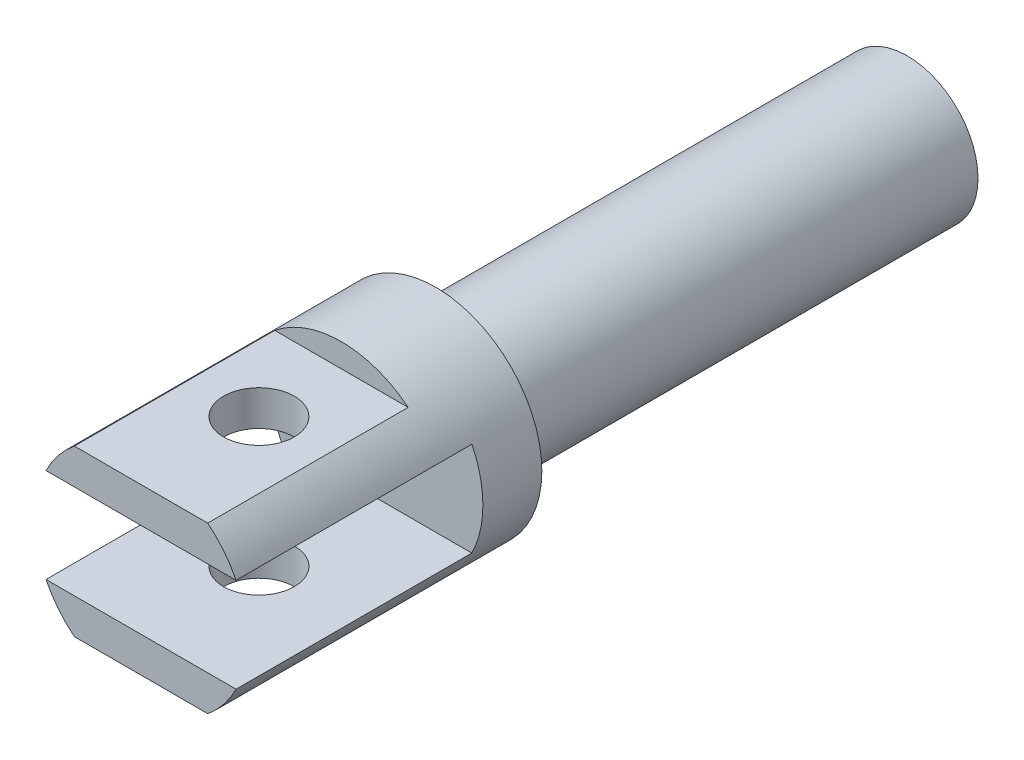
ISO-10303-21;
HEADER;
FILE_DESCRIPTION(('STEP AP214'),'2;1');
FILE_NAME('part.step','',(''),(''),'','','');
FILE_SCHEMA(('AUTOMOTIVE_DESIGN { 1 0 10303 214 1 1 1 1 }'));
ENDSEC;
DATA;
#1=APPLICATION_CONTEXT('core data for automotive mechanical design processes');
#2=APPLICATION_PROTOCOL_DEFINITION('international standard','automotive_design',2000,#1);
#3=PRODUCT_CONTEXT('',#1,'mechanical');
#4=PRODUCT('Part','Part','',(#3));
#5=PRODUCT_RELATED_PRODUCT_CATEGORY('part','',(#4));
#6=PRODUCT_DEFINITION_FORMATION('','',#4);
#7=PRODUCT_DEFINITION_CONTEXT('part definition',#1,'design');
#8=PRODUCT_DEFINITION('design','',#6,#7);
#9=PRODUCT_DEFINITION_SHAPE('','',#8);
#10=(LENGTH_UNIT() NAMED_UNIT(*) SI_UNIT(.MILLI.,.METRE.));
#11=(NAMED_UNIT(*) PLANE_ANGLE_UNIT() SI_UNIT($,.RADIAN.));
#12=(NAMED_UNIT(*) SI_UNIT($,.STERADIAN.) SOLID_ANGLE_UNIT());
#13=UNCERTAINTY_MEASURE_WITH_UNIT(LENGTH_MEASURE(1.E-05),#10,'distance_accuracy_value','');
#14=(GEOMETRIC_REPRESENTATION_CONTEXT(3) GLOBAL_UNCERTAINTY_ASSIGNED_CONTEXT((#13)) GLOBAL_UNIT_ASSIGNED_CONTEXT((#10,
#11,#12)) REPRESENTATION_CONTEXT('',''));
#15=CARTESIAN_POINT('',(0.,0.,0.));
#16=DIRECTION('',(0.,0.,1.));
#17=DIRECTION('',(1.,0.,0.));
#18=AXIS2_PLACEMENT_3D('',#15,#16,#17);
#19=CARTESIAN_POINT('',(0.,0.,44.4099510590377));
#20=DIRECTION('',(0.,0.,1.));
#21=DIRECTION('',(1.,0.,0.));
#22=AXIS2_PLACEMENT_3D('',#19,#20,#21);
#23=CYLINDRICAL_SURFACE('',#22,9.);
#24=CARTESIAN_POINT('',(0.,0.,0.));
#25=DIRECTION('',(0.,0.,1.));
#26=DIRECTION('',(1.,0.,0.));
#27=AXIS2_PLACEMENT_3D('',#24,#25,#26);
#28=CIRCLE('',#27,9.);
#29=CARTESIAN_POINT('',(9.,0.,0.));
#30=VERTEX_POINT('',#29);
#31=EDGE_CURVE('E148',#30,#30,#28,.T.);
#32=ORIENTED_EDGE('',*,*,#31,.T.);
#33=EDGE_LOOP('',(#32));
#34=FACE_BOUND('',#33,.T.);
#35=DIRECTION('',(0.,0.,1.));
#36=VECTOR('',#35,1.);
#37=CARTESIAN_POINT('',(5.65685424949238,-7.,44.4099510590377));
#38=LINE('',#37,#36);
#39=CARTESIAN_POINT('',(5.65685424949238,-7.,8.));
#40=VERTEX_POINT('',#39);
#41=CARTESIAN_POINT('',(5.65685424949238,-7.,25.));
#42=VERTEX_POINT('',#41);
#43=EDGE_CURVE('E51',#40,#42,#38,.T.);
#44=ORIENTED_EDGE('',*,*,#43,.F.);
#45=CARTESIAN_POINT('',(0.,0.,8.));
#46=DIRECTION('',(0.,0.,-1.));
#47=DIRECTION('',(-1.,0.,0.));
#48=AXIS2_PLACEMENT_3D('',#45,#46,#47);
#49=CIRCLE('',#48,9.);
#50=CARTESIAN_POINT('',(-5.65685424949237,-7.,8.));
#51=VERTEX_POINT('',#50);
#52=EDGE_CURVE('E11',#40,#51,#49,.T.);
#53=ORIENTED_EDGE('',*,*,#52,.T.);
#54=DIRECTION('',(0.,0.,1.));
#55=VECTOR('',#54,1.);
#56=CARTESIAN_POINT('',(-5.65685424949237,-7.,44.4099510590377));
#57=LINE('',#56,#55);
#58=CARTESIAN_POINT('',(-5.65685424949237,-7.,25.));
#59=VERTEX_POINT('',#58);
#60=EDGE_CURVE('E106',#59,#51,#57,.F.);
#61=ORIENTED_EDGE('',*,*,#60,.F.);
#62=CARTESIAN_POINT('',(0.,0.,25.));
#63=DIRECTION('',(0.,0.,1.));
#64=DIRECTION('',(1.,0.,0.));
#65=AXIS2_PLACEMENT_3D('',#62,#63,#64);
#66=CIRCLE('',#65,9.);
#67=CARTESIAN_POINT('',(-8.06225774829854,-4.,25.));
#68=VERTEX_POINT('',#67);
#69=EDGE_CURVE('E151',#68,#59,#66,.T.);
#70=ORIENTED_EDGE('',*,*,#69,.F.);
#71=DIRECTION('',(0.,0.,1.));
#72=VECTOR('',#71,1.);
#73=CARTESIAN_POINT('',(-8.06225774829854,-4.,44.4099510590377));
#74=LINE('',#73,#72);
#75=CARTESIAN_POINT('',(-8.06225774829855,-4.,5.));
#76=VERTEX_POINT('',#75);
#77=EDGE_CURVE('E164',#68,#76,#74,.F.);
#78=ORIENTED_EDGE('',*,*,#77,.T.);
#79=CARTESIAN_POINT('',(0.,0.,5.));
#80=DIRECTION('',(0.,0.,1.));
#81=DIRECTION('',(1.,0.,0.));
#82=AXIS2_PLACEMENT_3D('',#79,#80,#81);
#83=CIRCLE('',#82,9.);
#84=CARTESIAN_POINT('',(-8.06225774829855,4.,5.));
#85=VERTEX_POINT('',#84);
#86=EDGE_CURVE('E159',#85,#76,#83,.T.);
#87=ORIENTED_EDGE('',*,*,#86,.F.);
#88=DIRECTION('',(0.,0.,1.));
#89=VECTOR('',#88,1.);
#90=CARTESIAN_POINT('',(-8.06225774829854,4.,44.4099510590377));
#91=LINE('',#90,#89);
#92=CARTESIAN_POINT('',(-8.06225774829854,4.,25.));
#93=VERTEX_POINT('',#92);
#94=EDGE_CURVE('E167',#85,#93,#91,.T.);
#95=ORIENTED_EDGE('',*,*,#94,.T.);
#96=CARTESIAN_POINT('',(-5.65685424949237,7.,25.));
#97=VERTEX_POINT('',#96);
#98=EDGE_CURVE('E154',#97,#93,#66,.T.);
#99=ORIENTED_EDGE('',*,*,#98,.F.);
#100=DIRECTION('',(0.,0.,1.));
#101=VECTOR('',#100,1.);
#102=CARTESIAN_POINT('',(-5.65685424949237,7.,44.4099510590377));
#103=LINE('',#102,#101);
#104=CARTESIAN_POINT('',(-5.65685424949238,7.,8.));
#105=VERTEX_POINT('',#104);
#106=EDGE_CURVE('E126',#105,#97,#103,.T.);
#107=ORIENTED_EDGE('',*,*,#106,.F.);
#108=CARTESIAN_POINT('',(0.,0.,8.));
#109=DIRECTION('',(0.,0.,1.));
#110=DIRECTION('',(1.,0.,0.));
#111=AXIS2_PLACEMENT_3D('',#108,#109,#110);
#112=CIRCLE('',#111,9.);
#113=CARTESIAN_POINT('',(5.65685424949238,7.,8.));
#114=VERTEX_POINT('',#113);
#115=EDGE_CURVE('E44',#114,#105,#112,.T.);
#116=ORIENTED_EDGE('',*,*,#115,.F.);
#117=DIRECTION('',(0.,0.,1.));
#118=VECTOR('',#117,1.);
#119=CARTESIAN_POINT('',(5.65685424949238,7.,44.4099510590377));
#120=LINE('',#119,#118);
#121=CARTESIAN_POINT('',(5.65685424949238,7.,25.));
#122=VERTEX_POINT('',#121);
#123=EDGE_CURVE('E123',#122,#114,#120,.F.);
#124=ORIENTED_EDGE('',*,*,#123,.F.);
#125=CARTESIAN_POINT('',(8.06225774829855,4.,25.));
#126=VERTEX_POINT('',#125);
#127=EDGE_CURVE('E155',#126,#122,#66,.T.);
#128=ORIENTED_EDGE('',*,*,#127,.F.);
#129=DIRECTION('',(0.,0.,1.));
#130=VECTOR('',#129,1.);
#131=CARTESIAN_POINT('',(8.06225774829855,4.,44.4099510590377));
#132=LINE('',#131,#130);
#133=CARTESIAN_POINT('',(8.06225774829855,4.,5.));
#134=VERTEX_POINT('',#133);
#135=EDGE_CURVE('E161',#126,#134,#132,.F.);
#136=ORIENTED_EDGE('',*,*,#135,.T.);
#137=CARTESIAN_POINT('',(8.06225774829855,-4.,5.));
#138=VERTEX_POINT('',#137);
#139=EDGE_CURVE('E156',#138,#134,#83,.T.);
#140=ORIENTED_EDGE('',*,*,#139,.F.);
#141=DIRECTION('',(0.,0.,1.));
#142=VECTOR('',#141,1.);
#143=CARTESIAN_POINT('',(8.06225774829855,-4.,44.4099510590377));
#144=LINE('',#143,#142);
#145=CARTESIAN_POINT('',(8.06225774829855,-4.,25.));
#146=VERTEX_POINT('',#145);
#147=EDGE_CURVE('E158',#138,#146,#144,.T.);
#148=ORIENTED_EDGE('',*,*,#147,.T.);
#149=EDGE_CURVE('E111',#42,#146,#66,.T.);
#150=ORIENTED_EDGE('',*,*,#149,.F.);
#151=EDGE_LOOP('',(#44,#53,#61,#70,#78,#87,#95,#99,#107,#116,#124,#128,#136,#140,#148,#150));
#152=FACE_BOUND('',#151,.T.);
#153=ADVANCED_FACE('F36',(#34,#152),#23,.T.);
#154=CARTESIAN_POINT('',(0.,0.,25.));
#155=DIRECTION('',(0.,0.,1.));
#156=DIRECTION('',(1.,0.,0.));
#157=AXIS2_PLACEMENT_3D('',#154,#155,#156);
#158=PLANE('',#157);
#159=ORIENTED_EDGE('',*,*,#69,.T.);
#160=DIRECTION('',(1.,0.,0.));
#161=VECTOR('',#160,1.);
#162=CARTESIAN_POINT('',(8.06225774829855,-7.,25.));
#163=LINE('',#162,#161);
#164=EDGE_CURVE('E107',#59,#42,#163,.T.);
#165=ORIENTED_EDGE('',*,*,#164,.T.);
#166=ORIENTED_EDGE('',*,*,#149,.T.);
#167=DIRECTION('',(1.,0.,0.));
#168=VECTOR('',#167,1.);
#169=CARTESIAN_POINT('',(-8.99999999999999,-4.,25.));
#170=LINE('',#169,#168);
#171=EDGE_CURVE('E132',#68,#146,#170,.T.);
#172=ORIENTED_EDGE('',*,*,#171,.F.);
#173=EDGE_LOOP('',(#159,#165,#166,#172));
#174=FACE_BOUND('',#173,.T.);
#175=ADVANCED_FACE('F38',(#174),#158,.T.);
#176=CARTESIAN_POINT('',(0.,-9.,15.));
#177=DIRECTION('',(0.,1.,0.));
#178=DIRECTION('',(0.,0.,1.));
#179=AXIS2_PLACEMENT_3D('',#176,#177,#178);
#180=CYLINDRICAL_SURFACE('',#179,3.);
#181=CARTESIAN_POINT('',(0.,-4.,15.));
#182=DIRECTION('',(0.,-1.,0.));
#183=DIRECTION('',(0.,0.,-1.));
#184=AXIS2_PLACEMENT_3D('',#181,#182,#183);
#185=CIRCLE('',#184,3.);
#186=CARTESIAN_POINT('',(0.,-4.,12.));
#187=VERTEX_POINT('',#186);
#188=EDGE_CURVE('E128',#187,#187,#185,.T.);
#189=ORIENTED_EDGE('',*,*,#188,.F.);
#190=EDGE_LOOP('',(#189));
#191=FACE_BOUND('',#190,.T.);
#192=CARTESIAN_POINT('',(0.,-7.,15.));
#193=DIRECTION('',(0.,1.,0.));
#194=DIRECTION('',(0.,0.,1.));
#195=AXIS2_PLACEMENT_3D('',#192,#193,#194);
#196=CIRCLE('',#195,3.);
#197=CARTESIAN_POINT('',(0.,-7.,18.));
#198=VERTEX_POINT('',#197);
#199=EDGE_CURVE('E245',#198,#198,#196,.T.);
#200=ORIENTED_EDGE('',*,*,#199,.F.);
#201=EDGE_LOOP('',(#200));
#202=FACE_BOUND('',#201,.T.);
#203=ADVANCED_FACE('F198',(#191,#202),#180,.F.);
#204=ORIENTED_EDGE('',*,*,#127,.T.);
#205=DIRECTION('',(1.,0.,0.));
#206=VECTOR('',#205,1.);
#207=CARTESIAN_POINT('',(8.06225774829855,7.,25.));
#208=LINE('',#207,#206);
#209=EDGE_CURVE('E121',#97,#122,#208,.T.);
#210=ORIENTED_EDGE('',*,*,#209,.F.);
#211=ORIENTED_EDGE('',*,*,#98,.T.);
#212=DIRECTION('',(-1.,0.,0.));
#213=VECTOR('',#212,1.);
#214=CARTESIAN_POINT('',(-8.99999999999999,4.,25.));
#215=LINE('',#214,#213);
#216=EDGE_CURVE('E135',#126,#93,#215,.T.);
#217=ORIENTED_EDGE('',*,*,#216,.F.);
#218=EDGE_LOOP('',(#204,#210,#211,#217));
#219=FACE_BOUND('',#218,.T.);
#220=ADVANCED_FACE('F195',(#219),#158,.T.);
#221=CARTESIAN_POINT('',(0.,4.,15.));
#222=DIRECTION('',(0.,1.,0.));
#223=DIRECTION('',(0.,0.,1.));
#224=AXIS2_PLACEMENT_3D('',#221,#222,#223);
#225=CIRCLE('',#224,3.);
#226=CARTESIAN_POINT('',(0.,4.,18.));
#227=VERTEX_POINT('',#226);
#228=EDGE_CURVE('E129',#227,#227,#225,.T.);
#229=ORIENTED_EDGE('',*,*,#228,.F.);
#230=EDGE_LOOP('',(#229));
#231=FACE_BOUND('',#230,.T.);
#232=CARTESIAN_POINT('',(0.,7.,15.));
#233=DIRECTION('',(0.,1.,0.));
#234=DIRECTION('',(0.,0.,1.));
#235=AXIS2_PLACEMENT_3D('',#232,#233,#234);
#236=CIRCLE('',#235,3.);
#237=CARTESIAN_POINT('',(0.,7.,18.));
#238=VERTEX_POINT('',#237);
#239=EDGE_CURVE('E112',#238,#238,#236,.T.);
#240=ORIENTED_EDGE('',*,*,#239,.T.);
#241=EDGE_LOOP('',(#240));
#242=FACE_BOUND('',#241,.T.);
#243=ADVANCED_FACE('F197',(#231,#242),#180,.F.);
#244=CARTESIAN_POINT('',(0.,0.,0.));
#245=DIRECTION('',(0.,0.,1.));
#246=DIRECTION('',(1.,0.,0.));
#247=AXIS2_PLACEMENT_3D('',#244,#245,#246);
#248=PLANE('',#247);
#249=ORIENTED_EDGE('',*,*,#31,.F.);
#250=EDGE_LOOP('',(#249));
#251=FACE_BOUND('',#250,.T.);
#252=CARTESIAN_POINT('',(0.,0.,0.));
#253=DIRECTION('',(0.,0.,1.));
#254=DIRECTION('',(1.,0.,0.));
#255=AXIS2_PLACEMENT_3D('',#252,#253,#254);
#256=CIRCLE('',#255,5.99999999999999);
#257=CARTESIAN_POINT('',(6.,0.,0.));
#258=VERTEX_POINT('',#257);
#259=EDGE_CURVE('E145',#258,#258,#256,.T.);
#260=ORIENTED_EDGE('',*,*,#259,.T.);
#261=EDGE_LOOP('',(#260));
#262=FACE_BOUND('',#261,.T.);
#263=ADVANCED_FACE('F203',(#251,#262),#248,.F.);
#264=CARTESIAN_POINT('',(0.,0.,44.4099510590377));
#265=DIRECTION('',(0.,0.,1.));
#266=DIRECTION('',(1.,0.,0.));
#267=AXIS2_PLACEMENT_3D('',#264,#265,#266);
#268=CYLINDRICAL_SURFACE('',#267,5.99999999999999);
#269=ORIENTED_EDGE('',*,*,#259,.F.);
#270=EDGE_LOOP('',(#269));
#271=FACE_BOUND('',#270,.T.);
#272=CARTESIAN_POINT('',(0.,0.,-40.));
#273=DIRECTION('',(0.,0.,1.));
#274=DIRECTION('',(1.,0.,0.));
#275=AXIS2_PLACEMENT_3D('',#272,#273,#274);
#276=CIRCLE('',#275,5.99999999999999);
#277=CARTESIAN_POINT('',(5.99999999999999,0.,-40.));
#278=VERTEX_POINT('',#277);
#279=EDGE_CURVE('E138',#278,#278,#276,.T.);
#280=ORIENTED_EDGE('',*,*,#279,.T.);
#281=EDGE_LOOP('',(#280));
#282=FACE_BOUND('',#281,.T.);
#283=ADVANCED_FACE('F215',(#271,#282),#268,.T.);
#284=CARTESIAN_POINT('',(0.,0.,-40.));
#285=DIRECTION('',(0.,0.,1.));
#286=DIRECTION('',(1.,0.,0.));
#287=AXIS2_PLACEMENT_3D('',#284,#285,#286);
#288=PLANE('',#287);
#289=ORIENTED_EDGE('',*,*,#279,.F.);
#290=EDGE_LOOP('',(#289));
#291=FACE_BOUND('',#290,.T.);
#292=ADVANCED_FACE('F219',(#291),#288,.F.);
#293=CARTESIAN_POINT('',(-8.99999999999999,4.,5.));
#294=DIRECTION('',(0.,1.,0.));
#295=DIRECTION('',(0.,0.,1.));
#296=AXIS2_PLACEMENT_3D('',#293,#294,#295);
#297=PLANE('',#296);
#298=ORIENTED_EDGE('',*,*,#228,.T.);
#299=EDGE_LOOP('',(#298));
#300=FACE_BOUND('',#299,.T.);
#301=DIRECTION('',(-1.,0.,0.));
#302=VECTOR('',#301,1.);
#303=CARTESIAN_POINT('',(-8.99999999999999,4.,5.));
#304=LINE('',#303,#302);
#305=EDGE_CURVE('E134',#134,#85,#304,.T.);
#306=ORIENTED_EDGE('',*,*,#305,.F.);
#307=ORIENTED_EDGE('',*,*,#135,.F.);
#308=ORIENTED_EDGE('',*,*,#216,.T.);
#309=ORIENTED_EDGE('',*,*,#94,.F.);
#310=EDGE_LOOP('',(#306,#307,#308,#309));
#311=FACE_BOUND('',#310,.T.);
#312=ADVANCED_FACE('F194',(#300,#311),#297,.F.);
#313=CARTESIAN_POINT('',(-8.99999999999999,-4.,5.));
#314=DIRECTION('',(0.,-1.,0.));
#315=DIRECTION('',(0.,0.,-1.));
#316=AXIS2_PLACEMENT_3D('',#313,#314,#315);
#317=PLANE('',#316);
#318=ORIENTED_EDGE('',*,*,#188,.T.);
#319=EDGE_LOOP('',(#318));
#320=FACE_BOUND('',#319,.T.);
#321=DIRECTION('',(1.,0.,0.));
#322=VECTOR('',#321,1.);
#323=CARTESIAN_POINT('',(-8.99999999999999,-4.,5.));
#324=LINE('',#323,#322);
#325=EDGE_CURVE('E59',#76,#138,#324,.T.);
#326=ORIENTED_EDGE('',*,*,#325,.F.);
#327=ORIENTED_EDGE('',*,*,#77,.F.);
#328=ORIENTED_EDGE('',*,*,#171,.T.);
#329=ORIENTED_EDGE('',*,*,#147,.F.);
#330=EDGE_LOOP('',(#326,#327,#328,#329));
#331=FACE_BOUND('',#330,.T.);
#332=ADVANCED_FACE('F188',(#320,#331),#317,.F.);
#333=CARTESIAN_POINT('',(0.,0.,5.));
#334=DIRECTION('',(0.,0.,1.));
#335=DIRECTION('',(1.,0.,0.));
#336=AXIS2_PLACEMENT_3D('',#333,#334,#335);
#337=PLANE('',#336);
#338=ORIENTED_EDGE('',*,*,#305,.T.);
#339=ORIENTED_EDGE('',*,*,#86,.T.);
#340=ORIENTED_EDGE('',*,*,#325,.T.);
#341=ORIENTED_EDGE('',*,*,#139,.T.);
#342=EDGE_LOOP('',(#338,#339,#340,#341));
#343=FACE_BOUND('',#342,.T.);
#344=ADVANCED_FACE('F192',(#343),#337,.T.);
#345=CARTESIAN_POINT('',(8.06225774829855,9.,8.));
#346=DIRECTION('',(0.,0.,1.));
#347=DIRECTION('',(1.,0.,0.));
#348=AXIS2_PLACEMENT_3D('',#345,#346,#347);
#349=PLANE('',#348);
#350=DIRECTION('',(-1.,0.,0.));
#351=VECTOR('',#350,1.);
#352=CARTESIAN_POINT('',(8.06225774829855,7.,8.));
#353=LINE('',#352,#351);
#354=EDGE_CURVE('E115',#114,#105,#353,.T.);
#355=ORIENTED_EDGE('',*,*,#354,.F.);
#356=ORIENTED_EDGE('',*,*,#115,.T.);
#357=EDGE_LOOP('',(#355,#356));
#358=FACE_BOUND('',#357,.T.);
#359=ADVANCED_FACE('F173',(#358),#349,.T.);
#360=CARTESIAN_POINT('',(0.,7.,0.));
#361=DIRECTION('',(0.,1.,0.));
#362=DIRECTION('',(0.,0.,1.));
#363=AXIS2_PLACEMENT_3D('',#360,#361,#362);
#364=PLANE('',#363);
#365=ORIENTED_EDGE('',*,*,#239,.F.);
#366=EDGE_LOOP('',(#365));
#367=FACE_BOUND('',#366,.T.);
#368=ORIENTED_EDGE('',*,*,#106,.T.);
#369=ORIENTED_EDGE('',*,*,#209,.T.);
#370=ORIENTED_EDGE('',*,*,#123,.T.);
#371=ORIENTED_EDGE('',*,*,#354,.T.);
#372=EDGE_LOOP('',(#368,#369,#370,#371));
#373=FACE_BOUND('',#372,.T.);
#374=ADVANCED_FACE('F177',(#367,#373),#364,.T.);
#375=CARTESIAN_POINT('',(8.06225774829855,-9.,8.));
#376=DIRECTION('',(0.,0.,-1.));
#377=DIRECTION('',(-1.,0.,0.));
#378=AXIS2_PLACEMENT_3D('',#375,#376,#377);
#379=PLANE('',#378);
#380=DIRECTION('',(-1.,0.,0.));
#381=VECTOR('',#380,1.);
#382=CARTESIAN_POINT('',(8.06225774829855,-7.,8.));
#383=LINE('',#382,#381);
#384=EDGE_CURVE('E102',#40,#51,#383,.T.);
#385=ORIENTED_EDGE('',*,*,#384,.T.);
#386=ORIENTED_EDGE('',*,*,#52,.F.);
#387=EDGE_LOOP('',(#385,#386));
#388=FACE_BOUND('',#387,.T.);
#389=ADVANCED_FACE('F101',(#388),#379,.F.);
#390=CARTESIAN_POINT('',(0.,-7.,0.));
#391=DIRECTION('',(0.,-1.,0.));
#392=DIRECTION('',(0.,0.,1.));
#393=AXIS2_PLACEMENT_3D('',#390,#391,#392);
#394=PLANE('',#393);
#395=ORIENTED_EDGE('',*,*,#199,.T.);
#396=EDGE_LOOP('',(#395));
#397=FACE_BOUND('',#396,.T.);
#398=ORIENTED_EDGE('',*,*,#43,.T.);
#399=ORIENTED_EDGE('',*,*,#164,.F.);
#400=ORIENTED_EDGE('',*,*,#60,.T.);
#401=ORIENTED_EDGE('',*,*,#384,.F.);
#402=EDGE_LOOP('',(#398,#399,#400,#401));
#403=FACE_BOUND('',#402,.T.);
#404=ADVANCED_FACE('F105',(#397,#403),#394,.T.);
#405=CLOSED_SHELL('',(#153,#175,#203,#220,#243,#263,#283,#292,#312,#332,#344,#359,#374,#389,#404));
#406=MANIFOLD_SOLID_BREP('B2',#405);
#407=ADVANCED_BREP_SHAPE_REPRESENTATION('',(#18,#406),#14);
#408=SHAPE_DEFINITION_REPRESENTATION(#9,#407);
ENDSEC;
END-ISO-10303-21;
